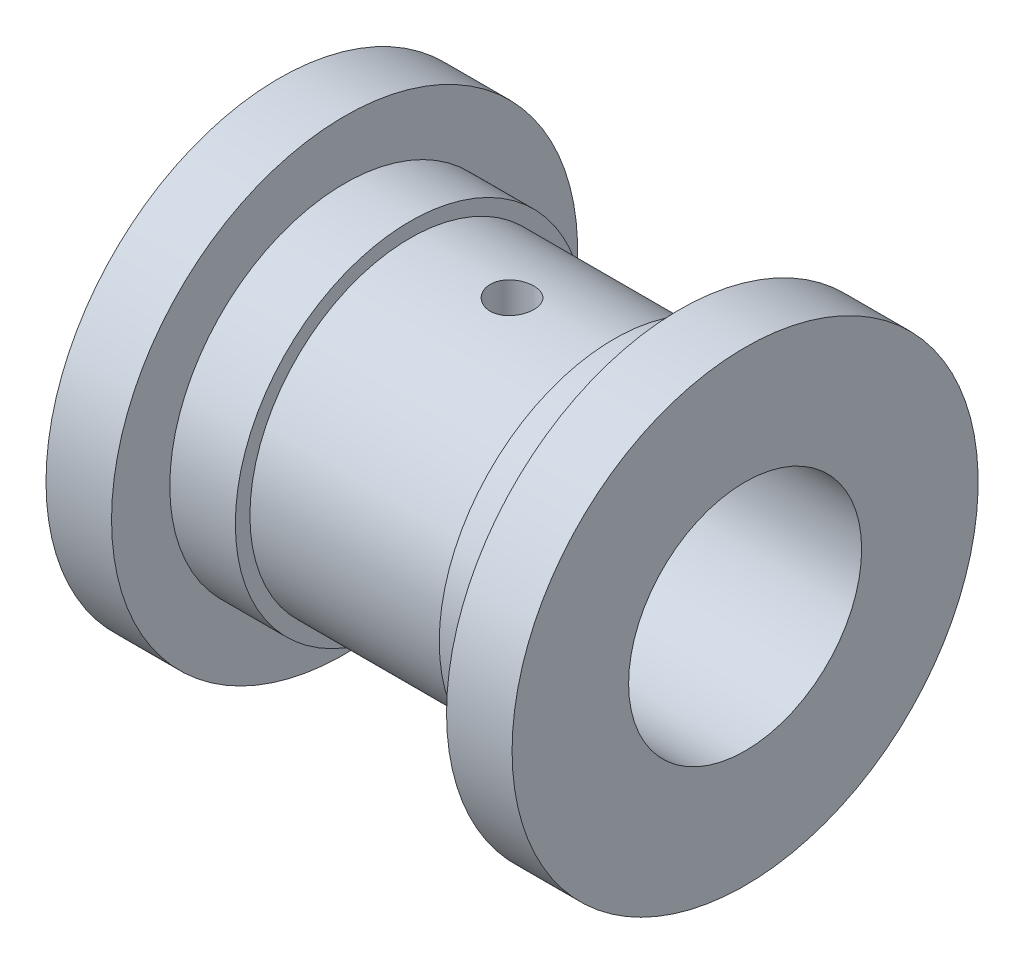
ISO-10303-21;
HEADER;
FILE_DESCRIPTION(('STEP AP214'),'2;1');
FILE_NAME('part.step','',(''),(''),'','','');
FILE_SCHEMA(('AUTOMOTIVE_DESIGN { 1 0 10303 214 1 1 1 1 }'));
ENDSEC;
DATA;
#1=APPLICATION_CONTEXT('core data for automotive mechanical design processes');
#2=APPLICATION_PROTOCOL_DEFINITION('international standard','automotive_design',2000,#1);
#3=PRODUCT_CONTEXT('',#1,'mechanical');
#4=PRODUCT('Part','Part','',(#3));
#5=PRODUCT_RELATED_PRODUCT_CATEGORY('part','',(#4));
#6=PRODUCT_DEFINITION_FORMATION('','',#4);
#7=PRODUCT_DEFINITION_CONTEXT('part definition',#1,'design');
#8=PRODUCT_DEFINITION('design','',#6,#7);
#9=PRODUCT_DEFINITION_SHAPE('','',#8);
#10=(LENGTH_UNIT() NAMED_UNIT(*) SI_UNIT(.MILLI.,.METRE.));
#11=(NAMED_UNIT(*) PLANE_ANGLE_UNIT() SI_UNIT($,.RADIAN.));
#12=(NAMED_UNIT(*) SI_UNIT($,.STERADIAN.) SOLID_ANGLE_UNIT());
#13=UNCERTAINTY_MEASURE_WITH_UNIT(LENGTH_MEASURE(1.E-05),#10,'distance_accuracy_value','');
#14=(GEOMETRIC_REPRESENTATION_CONTEXT(3) GLOBAL_UNCERTAINTY_ASSIGNED_CONTEXT((#13)) GLOBAL_UNIT_ASSIGNED_CONTEXT((#10,
#11,#12)) REPRESENTATION_CONTEXT('',''));
#15=CARTESIAN_POINT('',(0.,0.,0.));
#16=DIRECTION('',(0.,0.,1.));
#17=DIRECTION('',(1.,0.,0.));
#18=AXIS2_PLACEMENT_3D('',#15,#16,#17);
#19=CARTESIAN_POINT('',(0.,0.,0.));
#20=DIRECTION('',(-1.,0.,0.));
#21=DIRECTION('',(0.,0.,1.));
#22=AXIS2_PLACEMENT_3D('',#19,#20,#21);
#23=CYLINDRICAL_SURFACE('',#22,22.);
#24=CARTESIAN_POINT('',(0.,21.7944947177034,-2.99999999999999));
#25=CARTESIAN_POINT('',(0.167668655793931,21.7944973125222,-2.99999295397828));
#26=CARTESIAN_POINT('',(0.335438885571997,21.7964504822141,-2.98589613516891));
#27=CARTESIAN_POINT('',(0.666300949403407,21.8040481680046,-2.92988930626151));
#28=CARTESIAN_POINT('',(0.829387860056511,21.8096964302678,-2.88795106929476));
#29=CARTESIAN_POINT('',(1.14604557101637,21.8240329226108,-2.7775288562679));
#30=CARTESIAN_POINT('',(1.29962310318679,21.8327189725423,-2.70906391400625));
#31=CARTESIAN_POINT('',(1.59308393749802,21.8521497354893,-2.54757436301586));
#32=CARTESIAN_POINT('',(1.7329693781315,21.8628941262462,-2.4545535979434));
#33=CARTESIAN_POINT('',(1.99602918996937,21.8853107439761,-2.24593261550095));
#34=CARTESIAN_POINT('',(2.1190995206715,21.8969880962733,-2.13020174404837));
#35=CARTESIAN_POINT('',(2.34413561137156,21.9199089625179,-1.87972745186893));
#36=CARTESIAN_POINT('',(2.44610027468495,21.9311524538967,-1.74498304377951));
#37=CARTESIAN_POINT('',(2.62640880979331,21.9519917823356,-1.45964673364284));
#38=CARTESIAN_POINT('',(2.70465775314383,21.9615809332171,-1.30899431491146));
#39=CARTESIAN_POINT('',(2.83470513621746,21.9779746087792,-0.996533559622193));
#40=CARTESIAN_POINT('',(2.8865047367613,21.9847792556648,-0.834725713012595));
#41=CARTESIAN_POINT('',(2.96187006393192,21.9948010960819,-0.505615027627407));
#42=CARTESIAN_POINT('',(2.98560939170286,21.9980403391051,-0.338352625202421));
#43=CARTESIAN_POINT('',(3.00471876192814,22.0006418160325,-0.00218901989865446));
#44=CARTESIAN_POINT('',(3.0000901200993,22.0000042297454,0.166712106612738));
#45=CARTESIAN_POINT('',(2.96273314482717,21.9949416293269,0.500176134095487));
#46=CARTESIAN_POINT('',(2.93019154096828,21.9905417842193,0.664760389901234));
#47=CARTESIAN_POINT('',(2.83822479796852,21.9784771616625,0.986109968659574));
#48=CARTESIAN_POINT('',(2.77879906739157,21.9708123123852,1.14287511951189));
#49=CARTESIAN_POINT('',(2.6345555950203,21.9530355245634,1.44470900216683));
#50=CARTESIAN_POINT('',(2.54965799841274,21.9429159096715,1.58973910165001));
#51=CARTESIAN_POINT('',(2.35693890109396,21.9213599095811,1.86356465940335));
#52=CARTESIAN_POINT('',(2.24911615051486,21.9099234526045,1.99235923191068));
#53=CARTESIAN_POINT('',(2.01256398815935,21.8869019715346,2.2311563912285));
#54=CARTESIAN_POINT('',(1.88367170498197,21.8753164955576,2.34099765683571));
#55=CARTESIAN_POINT('',(1.60919608132634,21.8533940433535,2.53751386076588));
#56=CARTESIAN_POINT('',(1.46361266894254,21.8430570725053,2.62418869928228));
#57=CARTESIAN_POINT('',(1.15973309839801,21.8248023099056,2.77192629130126));
#58=CARTESIAN_POINT('',(1.00142980323137,21.816885888441,2.83297454471216));
#59=CARTESIAN_POINT('',(0.676685938855119,21.8043941534575,2.92757469616752));
#60=CARTESIAN_POINT('',(0.510245840045062,21.7998186470391,2.96112818173422));
#61=CARTESIAN_POINT('',(0.175382312986182,21.7945626889125,2.99956941672118));
#62=CARTESIAN_POINT('',(0.00698549676102247,21.7938512929769,3.00468490854895));
#63=CARTESIAN_POINT('',(-0.328262835866348,21.7963221316711,2.98670732293098));
#64=CARTESIAN_POINT('',(-0.495114391544076,21.7995042670648,2.96361496443093));
#65=CARTESIAN_POINT('',(-0.821843465157787,21.8093753071634,2.89006955453773));
#66=CARTESIAN_POINT('',(-0.98174658549237,21.8160498979624,2.83972815512374));
#67=CARTESIAN_POINT('',(-1.29084344925946,21.8321421092609,2.71322912313732));
#68=CARTESIAN_POINT('',(-1.44003674919156,21.8415598432741,2.63707042220061));
#69=CARTESIAN_POINT('',(-1.72450521244538,21.8621508077798,2.46054424209314));
#70=CARTESIAN_POINT('',(-1.85968743225273,21.8733346554527,2.36002824545062));
#71=CARTESIAN_POINT('',(-2.11134500486864,21.8961649833416,2.13784918546697));
#72=CARTESIAN_POINT('',(-2.22781948780175,21.9078114850387,2.01618513932771));
#73=CARTESIAN_POINT('',(-2.43956305361873,21.9303506440045,1.75416517490271));
#74=CARTESIAN_POINT('',(-2.53468192892494,21.9412376115705,1.61368731048534));
#75=CARTESIAN_POINT('',(-2.69997177807759,21.9609445601932,1.31861563564173));
#76=CARTESIAN_POINT('',(-2.77014333476204,21.9697645895377,1.1640221551012));
#77=CARTESIAN_POINT('',(-2.88330205185704,21.9843187797623,0.845593617063881));
#78=CARTESIAN_POINT('',(-2.92637398729284,21.9900625555325,0.681789143548597));
#79=CARTESIAN_POINT('',(-2.98438601535221,21.9978571930975,0.349189125621004));
#80=CARTESIAN_POINT('',(-2.99932763043926,21.9999082547485,0.180393851822026));
#81=CARTESIAN_POINT('',(-3.00062266554246,22.0000849669784,-0.155933944793776));
#82=CARTESIAN_POINT('',(-2.98720691376542,21.9982423123403,-0.323465608546989));
#83=CARTESIAN_POINT('',(-2.93265946872277,21.9909020074537,-0.653868527504434));
#84=CARTESIAN_POINT('',(-2.89152782222593,21.9854043633727,-0.816739790572309));
#85=CARTESIAN_POINT('',(-2.78279281440875,21.9713688879314,-1.13315387765858));
#86=CARTESIAN_POINT('',(-2.71520266767052,21.9628325744139,-1.28670131426866));
#87=CARTESIAN_POINT('',(-2.55549339551868,21.9436616719154,-1.58031159285156));
#88=CARTESIAN_POINT('',(-2.46337375671111,21.9330270390184,-1.72037415250691));
#89=CARTESIAN_POINT('',(-2.25637442655637,21.9107413064255,-1.98421472860385));
#90=CARTESIAN_POINT('',(-2.14132346408358,21.899082951343,-2.10785776937318));
#91=CARTESIAN_POINT('',(-1.89208624401361,21.8761200052605,-2.33416948478683));
#92=CARTESIAN_POINT('',(-1.75789548220963,21.864815498298,-2.43683320845294));
#93=CARTESIAN_POINT('',(-1.47347030664265,21.8437846234674,-2.61868613380123));
#94=CARTESIAN_POINT('',(-1.32316490840221,21.8340657568726,-2.69776514213642));
#95=CARTESIAN_POINT('',(-1.01135241536028,21.817394367016,-2.82944291998179));
#96=CARTESIAN_POINT('',(-0.849857473558309,21.8104388960614,-2.88206992162079));
#97=CARTESIAN_POINT('',(-0.572977203513979,21.8017355288375,-2.94703203226376));
#98=CARTESIAN_POINT('',(-0.45932357760318,21.7990341203125,-2.96686567785598));
#99=CARTESIAN_POINT('',(-0.230462622878617,21.7954128315745,-2.99335201931174));
#100=CARTESIAN_POINT('',(-0.115255309193854,21.7944929340268,-3.00000484343007));
#101=CARTESIAN_POINT('',(0.,21.7944947177034,-2.99999999999999));
#102=B_SPLINE_CURVE_WITH_KNOTS('',3,(#24,#25,#26,#27,#28,#29,#30,#31,#32,#33,#34,#35,#36,#37,
#38,#39,#40,#41,#42,#43,#44,#45,#46,#47,#48,#49,#50,#51,#52,#53,#54,#55,#56,#57,#58,#59,#60,#61,
#62,#63,#64,#65,#66,#67,#68,#69,#70,#71,#72,#73,#74,#75,#76,#77,#78,#79,#80,#81,#82,#83,#84,#85,
#86,#87,#88,#89,#90,#91,#92,#93,#94,#95,#96,#97,#98,#99,#100,#101),.UNSPECIFIED.,.T.,.F.,(4,2,2,
2,2,2,2,2,2,2,2,2,2,2,2,2,2,2,2,2,2,2,2,2,2,2,2,2,2,2,2,2,2,2,2,2,2,2,4),(0.,0.502584827322535,
1.00567997726411,1.50841480614355,2.0110709899168,2.51670860353079,3.02237248429927,
3.53003447052539,4.03767417433727,4.54215653413512,5.04661549603349,5.54772586150294,
6.04884725166251,6.55155638132178,7.05429292546101,7.56111742626898,8.06794411056383,
8.57505718337529,9.0821409738876,9.585157927571,10.0881620609109,10.5891205844915,
11.0900998411272,11.5942142584275,12.0983521093422,12.6059319233779,13.1134998781726,
13.6194720220333,14.125416780985,14.627259029653,15.1291004314968,15.6306915099823,
16.1322930874247,16.6377918045004,17.143409678468,17.6513541852325,18.158755407386,
18.5042352052811,18.8497116414994),.UNSPECIFIED.);
#103=CARTESIAN_POINT('',(0.,21.7944947177034,-2.99999999999999));
#104=VERTEX_POINT('',#103);
#105=EDGE_CURVE('E42',#104,#104,#102,.T.);
#106=ORIENTED_EDGE('',*,*,#105,.T.);
#107=EDGE_LOOP('',(#106));
#108=FACE_BOUND('',#107,.T.);
#109=CARTESIAN_POINT('',(-14.,0.,0.));
#110=DIRECTION('',(-1.,0.,0.));
#111=DIRECTION('',(0.,0.,1.));
#112=AXIS2_PLACEMENT_3D('',#109,#110,#111);
#113=CIRCLE('',#112,22.);
#114=CARTESIAN_POINT('',(-14.,0.,22.));
#115=VERTEX_POINT('',#114);
#116=EDGE_CURVE('E129',#115,#115,#113,.T.);
#117=ORIENTED_EDGE('',*,*,#116,.F.);
#118=EDGE_LOOP('',(#117));
#119=FACE_BOUND('',#118,.T.);
#120=CARTESIAN_POINT('',(14.,0.,0.));
#121=DIRECTION('',(-1.,0.,0.));
#122=DIRECTION('',(0.,0.,1.));
#123=AXIS2_PLACEMENT_3D('',#120,#121,#122);
#124=CIRCLE('',#123,22.);
#125=CARTESIAN_POINT('',(14.,0.,22.));
#126=VERTEX_POINT('',#125);
#127=EDGE_CURVE('E133',#126,#126,#124,.T.);
#128=ORIENTED_EDGE('',*,*,#127,.T.);
#129=EDGE_LOOP('',(#128));
#130=FACE_BOUND('',#129,.T.);
#131=CARTESIAN_POINT('',(0.,-21.6333076527839,-4.));
#132=CARTESIAN_POINT('',(0.22268024514592,-21.6333118939645,-3.99999133497668));
#133=CARTESIAN_POINT('',(0.445474382576009,-21.636783172832,-3.98134200846101));
#134=CARTESIAN_POINT('',(0.884789231745938,-21.650277261808,-3.907282639324));
#135=CARTESIAN_POINT('',(1.10130431933857,-21.6603057667963,-3.85184064204138));
#136=CARTESIAN_POINT('',(1.52164062603702,-21.6857418061113,-3.70594738579437));
#137=CARTESIAN_POINT('',(1.7254731306161,-21.7011444752348,-3.61552778385548));
#138=CARTESIAN_POINT('',(2.11505978325792,-21.7355875966023,-3.40232850816631));
#139=CARTESIAN_POINT('',(2.30081551603275,-21.7546277295314,-3.27955167453961));
#140=CARTESIAN_POINT('',(2.65116689488351,-21.7944494758657,-3.00359049647932));
#141=CARTESIAN_POINT('',(2.81552014846791,-21.8152472612912,-2.85010070695621));
#142=CARTESIAN_POINT('',(3.11629112566885,-21.8560978635286,-2.51773079268323));
#143=CARTESIAN_POINT('',(3.25270706729076,-21.8761506327525,-2.338849049527));
#144=CARTESIAN_POINT('',(3.49465463690047,-21.9134244798488,-1.95918683799973));
#145=CARTESIAN_POINT('',(3.59995853999161,-21.930624292806,-1.75825898095977));
#146=CARTESIAN_POINT('',(3.77522666605229,-21.9600735467303,-1.34119954887522));
#147=CARTESIAN_POINT('',(3.84519362101874,-21.9723233703801,-1.12506915065336));
#148=CARTESIAN_POINT('',(3.94705446651091,-21.9903782117666,-0.686249675641717));
#149=CARTESIAN_POINT('',(3.97935662864144,-21.9962522909049,-0.463658257037537));
#150=CARTESIAN_POINT('',(4.0062423349248,-22.0011316177893,-0.0161429459318502));
#151=CARTESIAN_POINT('',(4.00082890714308,-22.0001374169679,0.208780757870076));
#152=CARTESIAN_POINT('',(3.95275171584416,-21.9914463710423,0.65177839228148));
#153=CARTESIAN_POINT('',(3.91052749297112,-21.9838286175382,0.869901800106699));
#154=CARTESIAN_POINT('',(3.79072160507699,-21.9628349381595,1.29591498120673));
#155=CARTESIAN_POINT('',(3.71313870922753,-21.949458811838,1.50380439795921));
#156=CARTESIAN_POINT('',(3.52439388044169,-21.9183184074471,1.90473245090769));
#157=CARTESIAN_POINT('',(3.41305471193233,-21.9005310604676,2.09768578503493));
#158=CARTESIAN_POINT('',(3.16008822015063,-21.8625379364345,2.46233526714585));
#159=CARTESIAN_POINT('',(3.01845799412901,-21.8423319276856,2.63402937539644));
#160=CARTESIAN_POINT('',(2.70650309084144,-21.8013981618568,2.95388890108789));
#161=CARTESIAN_POINT('',(2.53579396416202,-21.7806670830423,3.10167918809898));
#162=CARTESIAN_POINT('',(2.17181187215816,-21.7412992413716,3.36658543928332));
#163=CARTESIAN_POINT('',(1.97853861446948,-21.7226625056581,3.48370100593934));
#164=CARTESIAN_POINT('',(1.57443497902635,-21.6895894681967,3.68403076498185));
#165=CARTESIAN_POINT('',(1.36357833672042,-21.6751596002547,3.76719310770445));
#166=CARTESIAN_POINT('',(0.930565100223262,-21.6522346695387,3.89680753773996));
#167=CARTESIAN_POINT('',(0.708409706977712,-21.6437389774287,3.94326351793351));
#168=CARTESIAN_POINT('',(0.262480397589181,-21.6337680818549,3.99760435703092));
#169=CARTESIAN_POINT('',(0.0387741346607272,-21.6321950076555,4.00602696978329));
#170=CARTESIAN_POINT('',(-0.406849101122151,-21.6359859030778,3.98550109557699));
#171=CARTESIAN_POINT('',(-0.628766156427925,-21.6413495511773,3.95655434071577));
#172=CARTESIAN_POINT('',(-1.06276068810456,-21.6583185875735,3.86257219277794));
#173=CARTESIAN_POINT('',(-1.27490076801606,-21.6698756001577,3.79781637710752));
#174=CARTESIAN_POINT('',(-1.68531943765688,-21.6978878160151,3.63434995143755));
#175=CARTESIAN_POINT('',(-1.88359705817135,-21.7143433613546,3.53563697012216));
#176=CARTESIAN_POINT('',(-2.26303839203049,-21.7505226830533,3.30581172375987));
#177=CARTESIAN_POINT('',(-2.44399223616877,-21.7702800968595,3.17435835883133));
#178=CARTESIAN_POINT('',(-2.78146738319551,-21.8107413258404,2.88324609901472));
#179=CARTESIAN_POINT('',(-2.93798662399931,-21.8314452207,2.72358482602649));
#180=CARTESIAN_POINT('',(-3.22414569229957,-21.8717797209063,2.37819260014522));
#181=CARTESIAN_POINT('',(-3.35342471072361,-21.8913936565351,2.19216046504753));
#182=CARTESIAN_POINT('',(-3.57889261216599,-21.9270616275553,1.80070523958705));
#183=CARTESIAN_POINT('',(-3.67508271455434,-21.9431157941211,1.59528286413569));
#184=CARTESIAN_POINT('',(-3.83109607727288,-21.9697834526315,1.17189643669068));
#185=CARTESIAN_POINT('',(-3.89109980975306,-21.9804239020959,0.954000658707901));
#186=CARTESIAN_POINT('',(-3.97361468659431,-21.9951799495618,0.511013297926958));
#187=CARTESIAN_POINT('',(-3.99612953027341,-21.9992961913554,0.28592242735846));
#188=CARTESIAN_POINT('',(-4.00290504221103,-22.0005282842776,-0.161599238057635));
#189=CARTESIAN_POINT('',(-3.98771177696937,-21.9977440646224,-0.384021675850897));
#190=CARTESIAN_POINT('',(-3.92069410715213,-21.9856946780428,-0.823089077981735));
#191=CARTESIAN_POINT('',(-3.86887000960198,-21.9764295654387,-1.03973409072766));
#192=CARTESIAN_POINT('',(-3.73028619302147,-21.9524581381546,-1.46083086688086));
#193=CARTESIAN_POINT('',(-3.64358130924888,-21.9377603669599,-1.6653011932924));
#194=CARTESIAN_POINT('',(-3.43776119438248,-21.9045184478405,-2.05687402388434));
#195=CARTESIAN_POINT('',(-3.31864396744516,-21.8859740630709,-2.24397545759469));
#196=CARTESIAN_POINT('',(-3.04948472287622,-21.8467718041457,-2.59822919507098));
#197=CARTESIAN_POINT('',(-2.89904660923133,-21.826088758947,-2.76507779716898));
#198=CARTESIAN_POINT('',(-2.57234096661293,-21.7851034058444,-3.07135244710173));
#199=CARTESIAN_POINT('',(-2.39606738287678,-21.7648011884524,-3.21077204872679));
#200=CARTESIAN_POINT('',(-2.02088064879777,-21.7266856567864,-3.45935343607217));
#201=CARTESIAN_POINT('',(-1.8217855213773,-21.7088952940926,-3.56824417003713));
#202=CARTESIAN_POINT('',(-1.40787344654803,-21.6780923491353,-3.75086117813966));
#203=CARTESIAN_POINT('',(-1.19307181678437,-21.6650751844592,-3.82462119925559));
#204=CARTESIAN_POINT('',(-0.814646631135487,-21.6480562150115,-3.91959792411038));
#205=CARTESIAN_POINT('',(-0.653261474782768,-21.642557744208,-3.94969798379532));
#206=CARTESIAN_POINT('',(-0.327938095935633,-21.6351819455147,-3.98990196850047));
#207=CARTESIAN_POINT('',(-0.163999935860683,-21.6333045292318,-4.00000638163151));
#208=CARTESIAN_POINT('',(0.,-21.6333076527839,-4.));
#209=B_SPLINE_CURVE_WITH_KNOTS('',3,(#131,#132,#133,#134,#135,#136,#137,#138,#139,#140,#141,
#142,#143,#144,#145,#146,#147,#148,#149,#150,#151,#152,#153,#154,#155,#156,#157,#158,#159,#160,
#161,#162,#163,#164,#165,#166,#167,#168,#169,#170,#171,#172,#173,#174,#175,#176,#177,#178,#179,
#180,#181,#182,#183,#184,#185,#186,#187,#188,#189,#190,#191,#192,#193,#194,#195,#196,#197,#198,
#199,#200,#201,#202,#203,#204,#205,#206,#207,#208),.UNSPECIFIED.,.T.,.F.,(4,2,2,2,2,2,2,2,2,2,2,
2,2,2,2,2,2,2,2,2,2,2,2,2,2,2,2,2,2,2,2,2,2,2,2,2,2,2,4),(0.,0.667440705257541,1.33546184685072,
2.00287979476302,2.67023918023371,3.3445987023052,4.01900122532956,4.69822425023956,
5.37739475450279,6.04913278831926,6.7208168910346,7.38458890585933,8.04838402822076,
8.71572656975959,9.38313309046882,10.0601670169629,10.7372097167831,11.4152824897346,
12.0932833402558,12.7616672929396,13.4300202666519,14.0932273132435,14.7564806826868,
15.4269564046825,16.0974886789026,16.7764104513919,17.4553072020415,18.1307894735074,
18.8062050859725,19.4718969577386,20.1375832499996,20.8022270968082,21.4669118794232,
22.1405775941432,22.8144014413677,23.4940309659146,24.1730063069362,24.6645762030324,
25.1561340993393),.UNSPECIFIED.);
#210=CARTESIAN_POINT('',(0.,-21.6333076527839,-4.));
#211=VERTEX_POINT('',#210);
#212=EDGE_CURVE('E10',#211,#211,#209,.T.);
#213=ORIENTED_EDGE('',*,*,#212,.F.);
#214=EDGE_LOOP('',(#213));
#215=FACE_BOUND('',#214,.T.);
#216=ADVANCED_FACE('F38',(#108,#119,#130,#215),#23,.T.);
#217=CARTESIAN_POINT('',(0.,0.,0.));
#218=DIRECTION('',(-1.,0.,0.));
#219=DIRECTION('',(0.,0.,1.));
#220=AXIS2_PLACEMENT_3D('',#217,#218,#219);
#221=CYLINDRICAL_SURFACE('',#220,32.);
#222=CARTESIAN_POINT('',(23.,0.,0.));
#223=DIRECTION('',(-1.,0.,0.));
#224=DIRECTION('',(0.,0.,1.));
#225=AXIS2_PLACEMENT_3D('',#222,#223,#224);
#226=CIRCLE('',#225,32.);
#227=CARTESIAN_POINT('',(23.,0.,32.));
#228=VERTEX_POINT('',#227);
#229=EDGE_CURVE('E52',#228,#228,#226,.T.);
#230=ORIENTED_EDGE('',*,*,#229,.F.);
#231=EDGE_LOOP('',(#230));
#232=FACE_BOUND('',#231,.T.);
#233=CARTESIAN_POINT('',(32.,0.,0.));
#234=DIRECTION('',(-1.,0.,0.));
#235=DIRECTION('',(0.,0.,1.));
#236=AXIS2_PLACEMENT_3D('',#233,#234,#235);
#237=CIRCLE('',#236,32.);
#238=CARTESIAN_POINT('',(32.,0.,32.));
#239=VERTEX_POINT('',#238);
#240=EDGE_CURVE('E157',#239,#239,#237,.T.);
#241=ORIENTED_EDGE('',*,*,#240,.T.);
#242=EDGE_LOOP('',(#241));
#243=FACE_BOUND('',#242,.T.);
#244=ADVANCED_FACE('F40',(#232,#243),#221,.T.);
#245=CARTESIAN_POINT('',(23.,32.,0.));
#246=DIRECTION('',(1.,0.,0.));
#247=DIRECTION('',(0.,0.,-1.));
#248=AXIS2_PLACEMENT_3D('',#245,#246,#247);
#249=PLANE('',#248);
#250=CARTESIAN_POINT('',(23.,0.,0.));
#251=DIRECTION('',(-1.,0.,0.));
#252=DIRECTION('',(0.,0.,1.));
#253=AXIS2_PLACEMENT_3D('',#250,#251,#252);
#254=CIRCLE('',#253,24.);
#255=CARTESIAN_POINT('',(23.,0.,24.));
#256=VERTEX_POINT('',#255);
#257=EDGE_CURVE('E57',#256,#256,#254,.T.);
#258=ORIENTED_EDGE('',*,*,#257,.F.);
#259=EDGE_LOOP('',(#258));
#260=FACE_BOUND('',#259,.T.);
#261=ORIENTED_EDGE('',*,*,#229,.T.);
#262=EDGE_LOOP('',(#261));
#263=FACE_BOUND('',#262,.T.);
#264=ADVANCED_FACE('F122',(#260,#263),#249,.F.);
#265=CARTESIAN_POINT('',(0.,0.,0.));
#266=DIRECTION('',(-1.,0.,0.));
#267=DIRECTION('',(0.,0.,1.));
#268=AXIS2_PLACEMENT_3D('',#265,#266,#267);
#269=CYLINDRICAL_SURFACE('',#268,24.);
#270=CARTESIAN_POINT('',(14.,0.,0.));
#271=DIRECTION('',(-1.,0.,0.));
#272=DIRECTION('',(0.,0.,1.));
#273=AXIS2_PLACEMENT_3D('',#270,#271,#272);
#274=CIRCLE('',#273,24.);
#275=CARTESIAN_POINT('',(14.,0.,24.));
#276=VERTEX_POINT('',#275);
#277=EDGE_CURVE('E136',#276,#276,#274,.T.);
#278=ORIENTED_EDGE('',*,*,#277,.F.);
#279=EDGE_LOOP('',(#278));
#280=FACE_BOUND('',#279,.T.);
#281=ORIENTED_EDGE('',*,*,#257,.T.);
#282=EDGE_LOOP('',(#281));
#283=FACE_BOUND('',#282,.T.);
#284=ADVANCED_FACE('F149',(#280,#283),#269,.T.);
#285=CARTESIAN_POINT('',(14.,24.,0.));
#286=DIRECTION('',(1.,0.,0.));
#287=DIRECTION('',(0.,0.,-1.));
#288=AXIS2_PLACEMENT_3D('',#285,#286,#287);
#289=PLANE('',#288);
#290=ORIENTED_EDGE('',*,*,#127,.F.);
#291=EDGE_LOOP('',(#290));
#292=FACE_BOUND('',#291,.T.);
#293=ORIENTED_EDGE('',*,*,#277,.T.);
#294=EDGE_LOOP('',(#293));
#295=FACE_BOUND('',#294,.T.);
#296=ADVANCED_FACE('F190',(#292,#295),#289,.F.);
#297=CARTESIAN_POINT('',(-14.,24.,0.));
#298=DIRECTION('',(-1.,0.,0.));
#299=DIRECTION('',(0.,0.,1.));
#300=AXIS2_PLACEMENT_3D('',#297,#298,#299);
#301=PLANE('',#300);
#302=CARTESIAN_POINT('',(-14.,0.,0.));
#303=DIRECTION('',(-1.,0.,0.));
#304=DIRECTION('',(0.,0.,1.));
#305=AXIS2_PLACEMENT_3D('',#302,#303,#304);
#306=CIRCLE('',#305,24.);
#307=CARTESIAN_POINT('',(-14.,0.,24.));
#308=VERTEX_POINT('',#307);
#309=EDGE_CURVE('E142',#308,#308,#306,.T.);
#310=ORIENTED_EDGE('',*,*,#309,.F.);
#311=EDGE_LOOP('',(#310));
#312=FACE_BOUND('',#311,.T.);
#313=ORIENTED_EDGE('',*,*,#116,.T.);
#314=EDGE_LOOP('',(#313));
#315=FACE_BOUND('',#314,.T.);
#316=ADVANCED_FACE('F187',(#312,#315),#301,.F.);
#317=CARTESIAN_POINT('',(0.,0.,0.));
#318=DIRECTION('',(-1.,0.,0.));
#319=DIRECTION('',(0.,0.,1.));
#320=AXIS2_PLACEMENT_3D('',#317,#318,#319);
#321=CYLINDRICAL_SURFACE('',#320,24.);
#322=CARTESIAN_POINT('',(-23.,0.,0.));
#323=DIRECTION('',(-1.,0.,0.));
#324=DIRECTION('',(0.,0.,1.));
#325=AXIS2_PLACEMENT_3D('',#322,#323,#324);
#326=CIRCLE('',#325,24.);
#327=CARTESIAN_POINT('',(-23.,0.,24.));
#328=VERTEX_POINT('',#327);
#329=EDGE_CURVE('E178',#328,#328,#326,.T.);
#330=ORIENTED_EDGE('',*,*,#329,.F.);
#331=EDGE_LOOP('',(#330));
#332=FACE_BOUND('',#331,.T.);
#333=ORIENTED_EDGE('',*,*,#309,.T.);
#334=EDGE_LOOP('',(#333));
#335=FACE_BOUND('',#334,.T.);
#336=ADVANCED_FACE('F185',(#332,#335),#321,.T.);
#337=CARTESIAN_POINT('',(-23.,32.,0.));
#338=DIRECTION('',(-1.,0.,0.));
#339=DIRECTION('',(0.,0.,1.));
#340=AXIS2_PLACEMENT_3D('',#337,#338,#339);
#341=PLANE('',#340);
#342=CARTESIAN_POINT('',(-23.,0.,0.));
#343=DIRECTION('',(-1.,0.,0.));
#344=DIRECTION('',(0.,0.,1.));
#345=AXIS2_PLACEMENT_3D('',#342,#343,#344);
#346=CIRCLE('',#345,32.);
#347=CARTESIAN_POINT('',(-23.,0.,32.));
#348=VERTEX_POINT('',#347);
#349=EDGE_CURVE('E174',#348,#348,#346,.T.);
#350=ORIENTED_EDGE('',*,*,#349,.F.);
#351=EDGE_LOOP('',(#350));
#352=FACE_BOUND('',#351,.T.);
#353=ORIENTED_EDGE('',*,*,#329,.T.);
#354=EDGE_LOOP('',(#353));
#355=FACE_BOUND('',#354,.T.);
#356=ADVANCED_FACE('F195',(#352,#355),#341,.F.);
#357=CARTESIAN_POINT('',(0.,0.,0.));
#358=DIRECTION('',(-1.,0.,0.));
#359=DIRECTION('',(0.,0.,1.));
#360=AXIS2_PLACEMENT_3D('',#357,#358,#359);
#361=CYLINDRICAL_SURFACE('',#360,32.);
#362=CARTESIAN_POINT('',(-32.,0.,0.));
#363=DIRECTION('',(-1.,0.,0.));
#364=DIRECTION('',(0.,0.,1.));
#365=AXIS2_PLACEMENT_3D('',#362,#363,#364);
#366=CIRCLE('',#365,32.);
#367=CARTESIAN_POINT('',(-32.,0.,32.));
#368=VERTEX_POINT('',#367);
#369=EDGE_CURVE('E170',#368,#368,#366,.T.);
#370=ORIENTED_EDGE('',*,*,#369,.F.);
#371=EDGE_LOOP('',(#370));
#372=FACE_BOUND('',#371,.T.);
#373=ORIENTED_EDGE('',*,*,#349,.T.);
#374=EDGE_LOOP('',(#373));
#375=FACE_BOUND('',#374,.T.);
#376=ADVANCED_FACE('F200',(#372,#375),#361,.T.);
#377=CARTESIAN_POINT('',(-32.,16.,0.));
#378=DIRECTION('',(1.,0.,0.));
#379=DIRECTION('',(0.,0.,-1.));
#380=AXIS2_PLACEMENT_3D('',#377,#378,#379);
#381=PLANE('',#380);
#382=CARTESIAN_POINT('',(-32.,0.,0.));
#383=DIRECTION('',(-1.,0.,0.));
#384=DIRECTION('',(0.,0.,1.));
#385=AXIS2_PLACEMENT_3D('',#382,#383,#384);
#386=CIRCLE('',#385,16.);
#387=CARTESIAN_POINT('',(-32.,0.,16.));
#388=VERTEX_POINT('',#387);
#389=EDGE_CURVE('E163',#388,#388,#386,.T.);
#390=ORIENTED_EDGE('',*,*,#389,.F.);
#391=EDGE_LOOP('',(#390));
#392=FACE_BOUND('',#391,.T.);
#393=ORIENTED_EDGE('',*,*,#369,.T.);
#394=EDGE_LOOP('',(#393));
#395=FACE_BOUND('',#394,.T.);
#396=ADVANCED_FACE('F83',(#392,#395),#381,.F.);
#397=CARTESIAN_POINT('',(0.,0.,0.));
#398=DIRECTION('',(-1.,0.,0.));
#399=DIRECTION('',(0.,0.,1.));
#400=AXIS2_PLACEMENT_3D('',#397,#398,#399);
#401=CYLINDRICAL_SURFACE('',#400,16.);
#402=CARTESIAN_POINT('',(0.,15.7162336455017,-2.99999999999999));
#403=CARTESIAN_POINT('',(-0.166914416025241,15.7162368759014,-2.99999359766588));
#404=CARTESIAN_POINT('',(-0.333911896437252,15.7189215952138,-2.98602252697897));
#405=CARTESIAN_POINT('',(-0.663197923163341,15.7293570202788,-2.93054506503583));
#406=CARTESIAN_POINT('',(-0.825482352854826,15.7371120234618,-2.88901531536946));
#407=CARTESIAN_POINT('',(-1.14053014274187,15.7567795293,-2.77974071235581));
#408=CARTESIAN_POINT('',(-1.29330221861461,15.7686881581205,-2.71202027908749));
#409=CARTESIAN_POINT('',(-1.58530711857359,15.7953165264186,-2.55235131520729));
#410=CARTESIAN_POINT('',(-1.72454099800659,15.8100360465123,-2.46040467518385));
#411=CARTESIAN_POINT('',(-1.98726039839827,15.8408322967791,-2.25367357885244));
#412=CARTESIAN_POINT('',(-2.11055296694346,15.8569223325136,-2.13864585866183));
#413=CARTESIAN_POINT('',(-2.33620877919912,15.8885291532806,-1.88954355760709));
#414=CARTESIAN_POINT('',(-2.43857064884958,15.904045900623,-1.75546772724988));
#415=CARTESIAN_POINT('',(-2.62019875320102,15.9329003565681,-1.47080778914032));
#416=CARTESIAN_POINT('',(-2.69928306703883,15.9462205610473,-1.32010568006773));
#417=CARTESIAN_POINT('',(-2.83093908454706,15.9690321726586,-1.00726256650152));
#418=CARTESIAN_POINT('',(-2.88351296798043,15.9785238945667,-0.845122503719008));
#419=CARTESIAN_POINT('',(-2.96005909722226,15.9925151024756,-0.516005492374829));
#420=CARTESIAN_POINT('',(-2.98435661184536,15.9970713195265,-0.349106646489712));
#421=CARTESIAN_POINT('',(-3.00467377540079,16.0008736923119,-0.0135433520707654));
#422=CARTESIAN_POINT('',(-3.0006958322781,16.0001203002139,0.15512094489534));
#423=CARTESIAN_POINT('',(-2.96482445770569,15.9934326752648,0.487196715798792));
#424=CARTESIAN_POINT('',(-2.93328126113997,15.9875634449443,0.650647520902937));
#425=CARTESIAN_POINT('',(-2.84372870120952,15.9713765266712,0.969894331430948));
#426=CARTESIAN_POINT('',(-2.78571837330838,15.9610586765993,1.12569005765308));
#427=CARTESIAN_POINT('',(-2.64454453788339,15.9370252059468,1.42622013150304));
#428=CARTESIAN_POINT('',(-2.561241024175,15.9232907518165,1.57088714367706));
#429=CARTESIAN_POINT('',(-2.37194866184568,15.893942950857,1.84431995442927));
#430=CARTESIAN_POINT('',(-2.26595750622483,15.8783294130233,1.97308413382156));
#431=CARTESIAN_POINT('',(-2.03236859403293,15.8466702736113,2.21313123793807));
#432=CARTESIAN_POINT('',(-1.90446443219585,15.8306217180324,2.32411581514082));
#433=CARTESIAN_POINT('',(-1.63170093744274,15.8001301784924,2.5231034370252));
#434=CARTESIAN_POINT('',(-1.48684135647073,15.785687218027,2.61110614542363));
#435=CARTESIAN_POINT('',(-1.18388345859467,15.7600378661424,2.76171704448954));
#436=CARTESIAN_POINT('',(-1.02576308561871,15.7488370106052,2.82428187290842));
#437=CARTESIAN_POINT('',(-0.700997631753596,15.7310248479338,2.92187313950111));
#438=CARTESIAN_POINT('',(-0.53435351907043,15.7244130207724,2.95690269802215));
#439=CARTESIAN_POINT('',(-0.199961342288242,15.7166304060201,2.99799345299477));
#440=CARTESIAN_POINT('',(-0.0322677688689702,15.7153791163227,3.00448328571716));
#441=CARTESIAN_POINT('',(0.301806910174295,15.7182438284168,2.98945937763448));
#442=CARTESIAN_POINT('',(0.468188080296165,15.7223595647722,2.96794702172865));
#443=CARTESIAN_POINT('',(0.793505806108773,15.7354196012641,2.89789736391764));
#444=CARTESIAN_POINT('',(0.952492505249788,15.7443237338176,2.84958477167978));
#445=CARTESIAN_POINT('',(1.26011437946031,15.7659226831324,2.72754448758119));
#446=CARTESIAN_POINT('',(1.40874879063066,15.7786177792656,2.65381492257589));
#447=CARTESIAN_POINT('',(1.69333523808633,15.8065515572737,2.48204706239319));
#448=CARTESIAN_POINT('',(1.82912107573214,15.8218179085063,2.38373799279241));
#449=CARTESIAN_POINT('',(2.08242408042866,15.853096227362,2.16596688688492));
#450=CARTESIAN_POINT('',(2.19993960311154,15.8691082619299,2.04650294866166));
#451=CARTESIAN_POINT('',(2.41496752706824,15.9003324801189,1.78789883574076));
#452=CARTESIAN_POINT('',(2.51219165321192,15.9155311166661,1.64851706819178));
#453=CARTESIAN_POINT('',(2.68184241235532,15.943188096207,1.35514904608028));
#454=CARTESIAN_POINT('',(2.75427000005,15.9556465446945,1.20116335407705));
#455=CARTESIAN_POINT('',(2.87184019572815,15.9763611599169,0.883755083157365));
#456=CARTESIAN_POINT('',(2.91712437512281,15.9846390946028,0.720386426157975));
#457=CARTESIAN_POINT('',(2.97957409657976,15.9961528416749,0.388192454763138));
#458=CARTESIAN_POINT('',(2.9967425973254,15.9993891845988,0.219367716431695));
#459=CARTESIAN_POINT('',(3.00237060303688,16.0004445503087,-0.116181520501011));
#460=CARTESIAN_POINT('',(2.99126550625909,15.9983457325,-0.282898614132512));
#461=CARTESIAN_POINT('',(2.94161514446308,15.9891373322347,-0.612046738558418));
#462=CARTESIAN_POINT('',(2.90307014251141,15.9820277978158,-0.774477810427459));
#463=CARTESIAN_POINT('',(2.79981758523271,15.9635967595586,-1.09021295119088));
#464=CARTESIAN_POINT('',(2.73515637423855,15.9522827196229,-1.24353263863613));
#465=CARTESIAN_POINT('',(2.58155909268905,15.9266674413841,-1.53721126263369));
#466=CARTESIAN_POINT('',(2.49262139578453,15.912366002962,-1.67756933000769));
#467=CARTESIAN_POINT('',(2.29149709111753,15.882095597166,-1.94351005555884));
#468=CARTESIAN_POINT('',(2.17899593228479,15.8661056917023,-2.06885247077666));
#469=CARTESIAN_POINT('',(1.93459087500637,15.8343926708998,-2.29903072131409));
#470=CARTESIAN_POINT('',(1.80268241922191,15.8186696191953,-2.403861726512));
#471=CARTESIAN_POINT('',(1.52174709061986,15.7891115480538,-2.59095267889404));
#472=CARTESIAN_POINT('',(1.3725731207714,15.7752953438736,-2.67299481058046));
#473=CARTESIAN_POINT('',(1.06234842014791,15.7513416912985,-2.8107226484115));
#474=CARTESIAN_POINT('',(0.901309066849273,15.7412007725928,-2.86643323276461));
#475=CARTESIAN_POINT('',(0.616495423852267,15.7278603261272,-2.93859453193229));
#476=CARTESIAN_POINT('',(0.494388552471806,15.7235262144357,-2.96158211479938));
#477=CARTESIAN_POINT('',(0.248203063163672,15.7177117118331,-2.99228702152191));
#478=CARTESIAN_POINT('',(0.124124499000657,15.7162312432422,-3.00000476104181));
#479=CARTESIAN_POINT('',(0.,15.7162336455017,-2.99999999999999));
#480=B_SPLINE_CURVE_WITH_KNOTS('',3,(#402,#403,#404,#405,#406,#407,#408,#409,#410,#411,#412,
#413,#414,#415,#416,#417,#418,#419,#420,#421,#422,#423,#424,#425,#426,#427,#428,#429,#430,#431,
#432,#433,#434,#435,#436,#437,#438,#439,#440,#441,#442,#443,#444,#445,#446,#447,#448,#449,#450,
#451,#452,#453,#454,#455,#456,#457,#458,#459,#460,#461,#462,#463,#464,#465,#466,#467,#468,#469,
#470,#471,#472,#473,#474,#475,#476,#477,#478,#479),.UNSPECIFIED.,.T.,.F.,(4,2,2,2,2,2,2,2,2,2,2,
2,2,2,2,2,2,2,2,2,2,2,2,2,2,2,2,2,2,2,2,2,2,2,2,2,2,2,4),(0.,0.500289011586372,1.00100260476078,
1.50125045595686,2.00145927987815,2.50724671397381,3.01306734138628,3.52274208696093,
4.03237491879279,4.5360855092052,5.03975320401295,5.53711301197447,6.03449094656847,
6.53467383968436,7.03490761823568,7.54281229528126,8.05072440384797,8.5594987223653,
9.06821537732972,9.56926497174147,10.0702897867743,10.5671758463073,11.0640985324863,
11.5667572530828,12.0694611878935,12.5788825099174,13.0882842164341,13.5950053883736,
14.1016732333466,14.6005860114027,15.0994940064433,15.5975205306071,16.0955804271421,
16.6007692801748,17.1060769546152,17.6160600363781,18.1255603150175,18.4976061505794,
18.8696418584436),.UNSPECIFIED.);
#481=CARTESIAN_POINT('',(0.,15.7162336455017,-2.99999999999999));
#482=VERTEX_POINT('',#481);
#483=EDGE_CURVE('E94',#482,#482,#480,.T.);
#484=ORIENTED_EDGE('',*,*,#483,.T.);
#485=EDGE_LOOP('',(#484));
#486=FACE_BOUND('',#485,.T.);
#487=CARTESIAN_POINT('',(0.,-15.7162336455017,-2.99999999999999));
#488=CARTESIAN_POINT('',(0.166914416025241,-15.7162368759014,-2.99999359766588));
#489=CARTESIAN_POINT('',(0.333911896437252,-15.7189215952138,-2.98602252697897));
#490=CARTESIAN_POINT('',(0.663197923163341,-15.7293570202788,-2.93054506503583));
#491=CARTESIAN_POINT('',(0.825482352854826,-15.7371120234618,-2.88901531536946));
#492=CARTESIAN_POINT('',(1.14053014274187,-15.7567795293,-2.77974071235581));
#493=CARTESIAN_POINT('',(1.29330221861461,-15.7686881581205,-2.71202027908749));
#494=CARTESIAN_POINT('',(1.58530711857359,-15.7953165264186,-2.55235131520729));
#495=CARTESIAN_POINT('',(1.72454099800659,-15.8100360465123,-2.46040467518385));
#496=CARTESIAN_POINT('',(1.98726039839827,-15.8408322967791,-2.25367357885244));
#497=CARTESIAN_POINT('',(2.11055296694346,-15.8569223325136,-2.13864585866183));
#498=CARTESIAN_POINT('',(2.33620877919912,-15.8885291532806,-1.88954355760709));
#499=CARTESIAN_POINT('',(2.43857064884958,-15.904045900623,-1.75546772724988));
#500=CARTESIAN_POINT('',(2.62019875320102,-15.9329003565681,-1.47080778914032));
#501=CARTESIAN_POINT('',(2.69928306703883,-15.9462205610473,-1.32010568006773));
#502=CARTESIAN_POINT('',(2.83093908454706,-15.9690321726586,-1.00726256650152));
#503=CARTESIAN_POINT('',(2.88351296798043,-15.9785238945667,-0.845122503719008));
#504=CARTESIAN_POINT('',(2.96005909722226,-15.9925151024756,-0.516005492374829));
#505=CARTESIAN_POINT('',(2.98435661184536,-15.9970713195265,-0.349106646489712));
#506=CARTESIAN_POINT('',(3.00467377540079,-16.0008736923119,-0.0135433520707654));
#507=CARTESIAN_POINT('',(3.0006958322781,-16.0001203002139,0.15512094489534));
#508=CARTESIAN_POINT('',(2.96482445770569,-15.9934326752648,0.487196715798792));
#509=CARTESIAN_POINT('',(2.93328126113997,-15.9875634449443,0.650647520902937));
#510=CARTESIAN_POINT('',(2.84372870120952,-15.9713765266712,0.969894331430948));
#511=CARTESIAN_POINT('',(2.78571837330838,-15.9610586765993,1.12569005765308));
#512=CARTESIAN_POINT('',(2.64454453788339,-15.9370252059468,1.42622013150304));
#513=CARTESIAN_POINT('',(2.561241024175,-15.9232907518165,1.57088714367706));
#514=CARTESIAN_POINT('',(2.37194866184568,-15.893942950857,1.84431995442927));
#515=CARTESIAN_POINT('',(2.26595750622483,-15.8783294130233,1.97308413382156));
#516=CARTESIAN_POINT('',(2.03236859403293,-15.8466702736113,2.21313123793807));
#517=CARTESIAN_POINT('',(1.90446443219585,-15.8306217180324,2.32411581514082));
#518=CARTESIAN_POINT('',(1.63170093744274,-15.8001301784924,2.5231034370252));
#519=CARTESIAN_POINT('',(1.48684135647073,-15.785687218027,2.61110614542363));
#520=CARTESIAN_POINT('',(1.18388345859467,-15.7600378661424,2.76171704448954));
#521=CARTESIAN_POINT('',(1.02576308561871,-15.7488370106052,2.82428187290842));
#522=CARTESIAN_POINT('',(0.700997631753596,-15.7310248479338,2.92187313950111));
#523=CARTESIAN_POINT('',(0.53435351907043,-15.7244130207724,2.95690269802215));
#524=CARTESIAN_POINT('',(0.199961342288242,-15.7166304060201,2.99799345299477));
#525=CARTESIAN_POINT('',(0.0322677688689702,-15.7153791163227,3.00448328571716));
#526=CARTESIAN_POINT('',(-0.301806910174295,-15.7182438284168,2.98945937763448));
#527=CARTESIAN_POINT('',(-0.468188080296165,-15.7223595647722,2.96794702172865));
#528=CARTESIAN_POINT('',(-0.793505806108773,-15.7354196012641,2.89789736391764));
#529=CARTESIAN_POINT('',(-0.952492505249788,-15.7443237338176,2.84958477167978));
#530=CARTESIAN_POINT('',(-1.26011437946031,-15.7659226831324,2.72754448758119));
#531=CARTESIAN_POINT('',(-1.40874879063066,-15.7786177792656,2.65381492257589));
#532=CARTESIAN_POINT('',(-1.69333523808633,-15.8065515572737,2.48204706239319));
#533=CARTESIAN_POINT('',(-1.82912107573214,-15.8218179085063,2.38373799279241));
#534=CARTESIAN_POINT('',(-2.08242408042866,-15.853096227362,2.16596688688492));
#535=CARTESIAN_POINT('',(-2.19993960311154,-15.8691082619299,2.04650294866166));
#536=CARTESIAN_POINT('',(-2.41496752706824,-15.9003324801189,1.78789883574076));
#537=CARTESIAN_POINT('',(-2.51219165321192,-15.9155311166661,1.64851706819178));
#538=CARTESIAN_POINT('',(-2.68184241235532,-15.943188096207,1.35514904608028));
#539=CARTESIAN_POINT('',(-2.75427000005,-15.9556465446945,1.20116335407705));
#540=CARTESIAN_POINT('',(-2.87184019572815,-15.9763611599169,0.883755083157365));
#541=CARTESIAN_POINT('',(-2.91712437512281,-15.9846390946028,0.720386426157975));
#542=CARTESIAN_POINT('',(-2.97957409657976,-15.9961528416749,0.388192454763138));
#543=CARTESIAN_POINT('',(-2.9967425973254,-15.9993891845988,0.219367716431695));
#544=CARTESIAN_POINT('',(-3.00237060303688,-16.0004445503087,-0.116181520501011));
#545=CARTESIAN_POINT('',(-2.99126550625909,-15.9983457325,-0.282898614132512));
#546=CARTESIAN_POINT('',(-2.94161514446308,-15.9891373322347,-0.612046738558418));
#547=CARTESIAN_POINT('',(-2.90307014251141,-15.9820277978158,-0.774477810427459));
#548=CARTESIAN_POINT('',(-2.79981758523271,-15.9635967595586,-1.09021295119088));
#549=CARTESIAN_POINT('',(-2.73515637423855,-15.9522827196229,-1.24353263863613));
#550=CARTESIAN_POINT('',(-2.58155909268905,-15.9266674413841,-1.53721126263369));
#551=CARTESIAN_POINT('',(-2.49262139578453,-15.912366002962,-1.67756933000769));
#552=CARTESIAN_POINT('',(-2.29149709111753,-15.882095597166,-1.94351005555884));
#553=CARTESIAN_POINT('',(-2.17899593228479,-15.8661056917023,-2.06885247077666));
#554=CARTESIAN_POINT('',(-1.93459087500637,-15.8343926708998,-2.29903072131409));
#555=CARTESIAN_POINT('',(-1.80268241922191,-15.8186696191953,-2.403861726512));
#556=CARTESIAN_POINT('',(-1.52174709061986,-15.7891115480538,-2.59095267889404));
#557=CARTESIAN_POINT('',(-1.3725731207714,-15.7752953438736,-2.67299481058046));
#558=CARTESIAN_POINT('',(-1.06234842014791,-15.7513416912985,-2.8107226484115));
#559=CARTESIAN_POINT('',(-0.901309066849273,-15.7412007725928,-2.86643323276461));
#560=CARTESIAN_POINT('',(-0.616495423852267,-15.7278603261272,-2.93859453193229));
#561=CARTESIAN_POINT('',(-0.494388552471806,-15.7235262144357,-2.96158211479938));
#562=CARTESIAN_POINT('',(-0.248203063163672,-15.7177117118331,-2.99228702152191));
#563=CARTESIAN_POINT('',(-0.124124499000657,-15.7162312432422,-3.00000476104181));
#564=CARTESIAN_POINT('',(0.,-15.7162336455017,-2.99999999999999));
#565=B_SPLINE_CURVE_WITH_KNOTS('',3,(#487,#488,#489,#490,#491,#492,#493,#494,#495,#496,#497,
#498,#499,#500,#501,#502,#503,#504,#505,#506,#507,#508,#509,#510,#511,#512,#513,#514,#515,#516,
#517,#518,#519,#520,#521,#522,#523,#524,#525,#526,#527,#528,#529,#530,#531,#532,#533,#534,#535,
#536,#537,#538,#539,#540,#541,#542,#543,#544,#545,#546,#547,#548,#549,#550,#551,#552,#553,#554,
#555,#556,#557,#558,#559,#560,#561,#562,#563,#564),.UNSPECIFIED.,.T.,.F.,(4,2,2,2,2,2,2,2,2,2,2,
2,2,2,2,2,2,2,2,2,2,2,2,2,2,2,2,2,2,2,2,2,2,2,2,2,2,2,4),(0.,0.500289011586372,1.00100260476078,
1.50125045595686,2.00145927987815,2.50724671397381,3.01306734138628,3.52274208696093,
4.03237491879279,4.5360855092052,5.03975320401295,5.53711301197447,6.03449094656847,
6.53467383968436,7.03490761823568,7.54281229528126,8.05072440384797,8.5594987223653,
9.06821537732972,9.56926497174147,10.0702897867743,10.5671758463073,11.0640985324863,
11.5667572530828,12.0694611878935,12.5788825099174,13.0882842164341,13.5950053883736,
14.1016732333466,14.6005860114027,15.0994940064433,15.5975205306071,16.0955804271421,
16.6007692801748,17.1060769546152,17.6160600363781,18.1255603150175,18.4976061505794,
18.8696418584436),.UNSPECIFIED.);
#566=CARTESIAN_POINT('',(0.,-15.7162336455017,-2.99999999999999));
#567=VERTEX_POINT('',#566);
#568=EDGE_CURVE('E88',#567,#567,#565,.T.);
#569=ORIENTED_EDGE('',*,*,#568,.T.);
#570=EDGE_LOOP('',(#569));
#571=FACE_BOUND('',#570,.T.);
#572=CARTESIAN_POINT('',(32.,0.,0.));
#573=DIRECTION('',(-1.,0.,0.));
#574=DIRECTION('',(0.,0.,1.));
#575=AXIS2_PLACEMENT_3D('',#572,#573,#574);
#576=CIRCLE('',#575,16.);
#577=CARTESIAN_POINT('',(32.,0.,16.));
#578=VERTEX_POINT('',#577);
#579=EDGE_CURVE('E159',#578,#578,#576,.T.);
#580=ORIENTED_EDGE('',*,*,#579,.F.);
#581=EDGE_LOOP('',(#580));
#582=FACE_BOUND('',#581,.T.);
#583=ORIENTED_EDGE('',*,*,#389,.T.);
#584=EDGE_LOOP('',(#583));
#585=FACE_BOUND('',#584,.T.);
#586=ADVANCED_FACE('F78',(#486,#571,#582,#585),#401,.F.);
#587=CARTESIAN_POINT('',(32.,16.,0.));
#588=DIRECTION('',(-1.,0.,0.));
#589=DIRECTION('',(0.,0.,1.));
#590=AXIS2_PLACEMENT_3D('',#587,#588,#589);
#591=PLANE('',#590);
#592=ORIENTED_EDGE('',*,*,#240,.F.);
#593=EDGE_LOOP('',(#592));
#594=FACE_BOUND('',#593,.T.);
#595=ORIENTED_EDGE('',*,*,#579,.T.);
#596=EDGE_LOOP('',(#595));
#597=FACE_BOUND('',#596,.T.);
#598=ADVANCED_FACE('F75',(#594,#597),#591,.F.);
#599=CARTESIAN_POINT('',(0.,-30.,0.));
#600=DIRECTION('',(0.,1.,0.));
#601=DIRECTION('',(0.,0.,1.));
#602=AXIS2_PLACEMENT_3D('',#599,#600,#601);
#603=PLANE('',#602);
#604=CARTESIAN_POINT('',(0.,-30.,0.));
#605=DIRECTION('',(0.,-1.,0.));
#606=DIRECTION('',(0.,0.,-1.));
#607=AXIS2_PLACEMENT_3D('',#604,#605,#606);
#608=CIRCLE('',#607,2.99999999999999);
#609=CARTESIAN_POINT('',(0.,-30.,-2.99999999999999));
#610=VERTEX_POINT('',#609);
#611=EDGE_CURVE('E315',#610,#610,#608,.T.);
#612=ORIENTED_EDGE('',*,*,#611,.F.);
#613=EDGE_LOOP('',(#612));
#614=FACE_BOUND('',#613,.T.);
#615=CARTESIAN_POINT('',(0.,-30.,0.));
#616=DIRECTION('',(0.,1.,0.));
#617=DIRECTION('',(0.,0.,1.));
#618=AXIS2_PLACEMENT_3D('',#615,#616,#617);
#619=CIRCLE('',#618,4.);
#620=CARTESIAN_POINT('',(0.,-30.,4.));
#621=VERTEX_POINT('',#620);
#622=EDGE_CURVE('E101',#621,#621,#619,.T.);
#623=ORIENTED_EDGE('',*,*,#622,.F.);
#624=EDGE_LOOP('',(#623));
#625=FACE_BOUND('',#624,.T.);
#626=ADVANCED_FACE('F73',(#614,#625),#603,.F.);
#627=CARTESIAN_POINT('',(0.,32.002,0.));
#628=DIRECTION('',(0.,-1.,0.));
#629=DIRECTION('',(0.,0.,-1.));
#630=AXIS2_PLACEMENT_3D('',#627,#628,#629);
#631=CYLINDRICAL_SURFACE('',#630,4.);
#632=ORIENTED_EDGE('',*,*,#622,.T.);
#633=EDGE_LOOP('',(#632));
#634=FACE_BOUND('',#633,.T.);
#635=ORIENTED_EDGE('',*,*,#212,.T.);
#636=EDGE_LOOP('',(#635));
#637=FACE_BOUND('',#636,.T.);
#638=ADVANCED_FACE('F67',(#634,#637),#631,.T.);
#639=CARTESIAN_POINT('',(0.,-30.,0.));
#640=DIRECTION('',(0.,-1.,0.));
#641=DIRECTION('',(0.,0.,-1.));
#642=AXIS2_PLACEMENT_3D('',#639,#640,#641);
#643=CYLINDRICAL_SURFACE('',#642,2.99999999999999);
#644=ORIENTED_EDGE('',*,*,#105,.F.);
#645=EDGE_LOOP('',(#644));
#646=FACE_BOUND('',#645,.T.);
#647=ORIENTED_EDGE('',*,*,#483,.F.);
#648=EDGE_LOOP('',(#647));
#649=FACE_BOUND('',#648,.T.);
#650=ADVANCED_FACE('F72',(#646,#649),#643,.F.);
#651=ORIENTED_EDGE('',*,*,#611,.T.);
#652=EDGE_LOOP('',(#651));
#653=FACE_BOUND('',#652,.T.);
#654=ORIENTED_EDGE('',*,*,#568,.F.);
#655=EDGE_LOOP('',(#654));
#656=FACE_BOUND('',#655,.T.);
#657=ADVANCED_FACE('F105',(#653,#656),#643,.F.);
#658=CLOSED_SHELL('',(#216,#244,#264,#284,#296,#316,#336,#356,#376,#396,#586,#598,#626,#638,
#650,#657));
#659=MANIFOLD_SOLID_BREP('B2',#658);
#660=ADVANCED_BREP_SHAPE_REPRESENTATION('',(#18,#659),#14);
#661=SHAPE_DEFINITION_REPRESENTATION(#9,#660);
ENDSEC;
END-ISO-10303-21;
